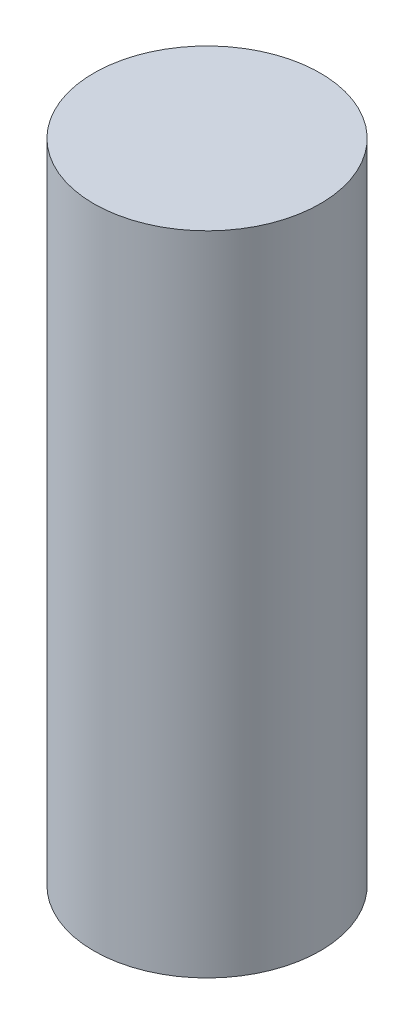
ISO-10303-21;
HEADER;
FILE_DESCRIPTION(('STEP AP214'),'2;1');
FILE_NAME('part.step','',(''),(''),'','','');
FILE_SCHEMA(('AUTOMOTIVE_DESIGN { 1 0 10303 214 1 1 1 1 }'));
ENDSEC;
DATA;
#1=APPLICATION_CONTEXT('core data for automotive mechanical design processes');
#2=APPLICATION_PROTOCOL_DEFINITION('international standard','automotive_design',2000,#1);
#3=PRODUCT_CONTEXT('',#1,'mechanical');
#4=PRODUCT('Part','Part','',(#3));
#5=PRODUCT_RELATED_PRODUCT_CATEGORY('part','',(#4));
#6=PRODUCT_DEFINITION_FORMATION('','',#4);
#7=PRODUCT_DEFINITION_CONTEXT('part definition',#1,'design');
#8=PRODUCT_DEFINITION('design','',#6,#7);
#9=PRODUCT_DEFINITION_SHAPE('','',#8);
#10=(LENGTH_UNIT() NAMED_UNIT(*) SI_UNIT(.MILLI.,.METRE.));
#11=(NAMED_UNIT(*) PLANE_ANGLE_UNIT() SI_UNIT($,.RADIAN.));
#12=(NAMED_UNIT(*) SI_UNIT($,.STERADIAN.) SOLID_ANGLE_UNIT());
#13=UNCERTAINTY_MEASURE_WITH_UNIT(LENGTH_MEASURE(1.E-05),#10,'distance_accuracy_value','');
#14=(GEOMETRIC_REPRESENTATION_CONTEXT(3) GLOBAL_UNCERTAINTY_ASSIGNED_CONTEXT((#13)) GLOBAL_UNIT_ASSIGNED_CONTEXT((#10,
#11,#12)) REPRESENTATION_CONTEXT('',''));
#15=CARTESIAN_POINT('',(0.,0.,0.));
#16=DIRECTION('',(0.,0.,1.));
#17=DIRECTION('',(1.,0.,0.));
#18=AXIS2_PLACEMENT_3D('',#15,#16,#17);
#19=CARTESIAN_POINT('',(0.,101.6,0.));
#20=DIRECTION('',(0.,-1.,0.));
#21=DIRECTION('',(0.,0.,-1.));
#22=AXIS2_PLACEMENT_3D('',#19,#20,#21);
#23=CYLINDRICAL_SURFACE('',#22,35.56);
#24=CARTESIAN_POINT('',(0.,101.6,0.));
#25=DIRECTION('',(0.,1.,0.));
#26=DIRECTION('',(0.,0.,1.));
#27=AXIS2_PLACEMENT_3D('',#24,#25,#26);
#28=CIRCLE('',#27,35.56);
#29=CARTESIAN_POINT('',(0.,101.6,35.56));
#30=VERTEX_POINT('',#29);
#31=EDGE_CURVE('E10',#30,#30,#28,.T.);
#32=ORIENTED_EDGE('',*,*,#31,.F.);
#33=EDGE_LOOP('',(#32));
#34=FACE_BOUND('',#33,.T.);
#35=CARTESIAN_POINT('',(0.,-101.6,0.));
#36=DIRECTION('',(0.,1.,0.));
#37=DIRECTION('',(0.,0.,1.));
#38=AXIS2_PLACEMENT_3D('',#35,#36,#37);
#39=CIRCLE('',#38,35.56);
#40=CARTESIAN_POINT('',(0.,-101.6,35.56));
#41=VERTEX_POINT('',#40);
#42=EDGE_CURVE('E34',#41,#41,#39,.T.);
#43=ORIENTED_EDGE('',*,*,#42,.T.);
#44=EDGE_LOOP('',(#43));
#45=FACE_BOUND('',#44,.T.);
#46=ADVANCED_FACE('F31',(#34,#45),#23,.T.);
#47=CARTESIAN_POINT('',(0.,101.6,0.));
#48=DIRECTION('',(0.,1.,0.));
#49=DIRECTION('',(0.,0.,1.));
#50=AXIS2_PLACEMENT_3D('',#47,#48,#49);
#51=PLANE('',#50);
#52=ORIENTED_EDGE('',*,*,#31,.T.);
#53=EDGE_LOOP('',(#52));
#54=FACE_BOUND('',#53,.T.);
#55=ADVANCED_FACE('F46',(#54),#51,.T.);
#56=CARTESIAN_POINT('',(0.,-101.6,0.));
#57=DIRECTION('',(0.,1.,0.));
#58=DIRECTION('',(0.,0.,1.));
#59=AXIS2_PLACEMENT_3D('',#56,#57,#58);
#60=PLANE('',#59);
#61=ORIENTED_EDGE('',*,*,#42,.F.);
#62=EDGE_LOOP('',(#61));
#63=FACE_BOUND('',#62,.T.);
#64=ADVANCED_FACE('F44',(#63),#60,.F.);
#65=CLOSED_SHELL('',(#46,#55,#64));
#66=MANIFOLD_SOLID_BREP('B2',#65);
#67=ADVANCED_BREP_SHAPE_REPRESENTATION('',(#18,#66),#14);
#68=SHAPE_DEFINITION_REPRESENTATION(#9,#67);
ENDSEC;
END-ISO-10303-21;
